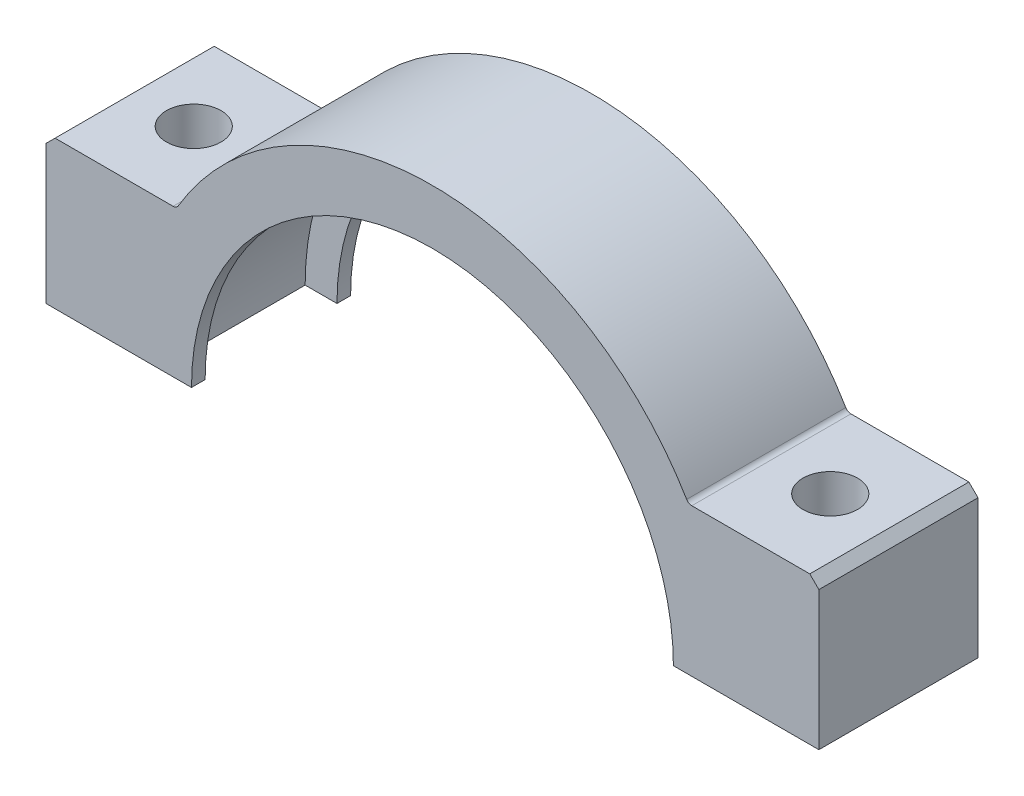
ISO-10303-21;
HEADER;
FILE_DESCRIPTION(('STEP AP214'),'2;1');
FILE_NAME('part.step','',(''),(''),'','','');
FILE_SCHEMA(('AUTOMOTIVE_DESIGN { 1 0 10303 214 1 1 1 1 }'));
ENDSEC;
DATA;
#1=APPLICATION_CONTEXT('core data for automotive mechanical design processes');
#2=APPLICATION_PROTOCOL_DEFINITION('international standard','automotive_design',2000,#1);
#3=PRODUCT_CONTEXT('',#1,'mechanical');
#4=PRODUCT('Part','Part','',(#3));
#5=PRODUCT_RELATED_PRODUCT_CATEGORY('part','',(#4));
#6=PRODUCT_DEFINITION_FORMATION('','',#4);
#7=PRODUCT_DEFINITION_CONTEXT('part definition',#1,'design');
#8=PRODUCT_DEFINITION('design','',#6,#7);
#9=PRODUCT_DEFINITION_SHAPE('','',#8);
#10=(LENGTH_UNIT() NAMED_UNIT(*) SI_UNIT(.MILLI.,.METRE.));
#11=(NAMED_UNIT(*) PLANE_ANGLE_UNIT() SI_UNIT($,.RADIAN.));
#12=(NAMED_UNIT(*) SI_UNIT($,.STERADIAN.) SOLID_ANGLE_UNIT());
#13=UNCERTAINTY_MEASURE_WITH_UNIT(LENGTH_MEASURE(1.E-05),#10,'distance_accuracy_value','');
#14=(GEOMETRIC_REPRESENTATION_CONTEXT(3) GLOBAL_UNCERTAINTY_ASSIGNED_CONTEXT((#13)) GLOBAL_UNIT_ASSIGNED_CONTEXT((#10,
#11,#12)) REPRESENTATION_CONTEXT('',''));
#15=CARTESIAN_POINT('',(0.,0.,0.));
#16=DIRECTION('',(0.,0.,1.));
#17=DIRECTION('',(1.,0.,0.));
#18=AXIS2_PLACEMENT_3D('',#15,#16,#17);
#19=CARTESIAN_POINT('',(-85.,30.5,14.5));
#20=DIRECTION('',(-0.707106781186547,0.707106781186547,0.));
#21=DIRECTION('',(-0.707106781186548,-0.707106781186548,0.));
#22=AXIS2_PLACEMENT_3D('',#19,#20,#21);
#23=PLANE('',#22);
#24=DIRECTION('',(0.,0.,-1.));
#25=VECTOR('',#24,1.);
#26=CARTESIAN_POINT('',(-83.,32.5,14.5));
#27=LINE('',#26,#25);
#28=CARTESIAN_POINT('',(-83.,32.5,17.5));
#29=VERTEX_POINT('',#28);
#30=CARTESIAN_POINT('',(-83.,32.5,-17.5));
#31=VERTEX_POINT('',#30);
#32=EDGE_CURVE('E234',#29,#31,#27,.T.);
#33=ORIENTED_EDGE('',*,*,#32,.T.);
#34=DIRECTION('',(0.707106781186547,0.707106781186547,0.));
#35=VECTOR('',#34,1.);
#36=CARTESIAN_POINT('',(-85.,30.5,-17.5));
#37=LINE('',#36,#35);
#38=CARTESIAN_POINT('',(-85.,30.5,-17.5));
#39=VERTEX_POINT('',#38);
#40=EDGE_CURVE('E324',#39,#31,#37,.T.);
#41=ORIENTED_EDGE('',*,*,#40,.F.);
#42=DIRECTION('',(0.,0.,-1.));
#43=VECTOR('',#42,1.);
#44=CARTESIAN_POINT('',(-85.,30.5,14.5));
#45=LINE('',#44,#43);
#46=CARTESIAN_POINT('',(-85.,30.5,17.5));
#47=VERTEX_POINT('',#46);
#48=EDGE_CURVE('E11',#47,#39,#45,.T.);
#49=ORIENTED_EDGE('',*,*,#48,.F.);
#50=DIRECTION('',(-0.707106781186547,-0.707106781186547,0.));
#51=VECTOR('',#50,1.);
#52=CARTESIAN_POINT('',(-85.,30.5,17.5));
#53=LINE('',#52,#51);
#54=EDGE_CURVE('E188',#29,#47,#53,.T.);
#55=ORIENTED_EDGE('',*,*,#54,.F.);
#56=EDGE_LOOP('',(#33,#41,#49,#55));
#57=FACE_BOUND('',#56,.T.);
#58=ADVANCED_FACE('F32',(#57),#23,.T.);
#59=CARTESIAN_POINT('',(-85.,0.,14.5));
#60=DIRECTION('',(-1.,0.,0.));
#61=DIRECTION('',(0.,0.,1.));
#62=AXIS2_PLACEMENT_3D('',#59,#60,#61);
#63=PLANE('',#62);
#64=ORIENTED_EDGE('',*,*,#48,.T.);
#65=DIRECTION('',(0.,1.,0.));
#66=VECTOR('',#65,1.);
#67=CARTESIAN_POINT('',(-85.,0.,-17.5));
#68=LINE('',#67,#66);
#69=CARTESIAN_POINT('',(-85.,0.,-17.5));
#70=VERTEX_POINT('',#69);
#71=EDGE_CURVE('E338',#70,#39,#68,.T.);
#72=ORIENTED_EDGE('',*,*,#71,.F.);
#73=DIRECTION('',(0.,0.,-1.));
#74=VECTOR('',#73,1.);
#75=CARTESIAN_POINT('',(-85.,0.,14.5));
#76=LINE('',#75,#74);
#77=CARTESIAN_POINT('',(-85.,0.,17.5));
#78=VERTEX_POINT('',#77);
#79=EDGE_CURVE('E42',#78,#70,#76,.T.);
#80=ORIENTED_EDGE('',*,*,#79,.F.);
#81=DIRECTION('',(0.,-1.,0.));
#82=VECTOR('',#81,1.);
#83=CARTESIAN_POINT('',(-85.,0.,17.5));
#84=LINE('',#83,#82);
#85=EDGE_CURVE('E186',#47,#78,#84,.T.);
#86=ORIENTED_EDGE('',*,*,#85,.F.);
#87=EDGE_LOOP('',(#64,#72,#80,#86));
#88=FACE_BOUND('',#87,.T.);
#89=ADVANCED_FACE('F314',(#88),#63,.T.);
#90=CARTESIAN_POINT('',(-60.,0.,14.5));
#91=DIRECTION('',(0.,-1.,0.));
#92=DIRECTION('',(1.,0.,0.));
#93=AXIS2_PLACEMENT_3D('',#90,#91,#92);
#94=PLANE('',#93);
#95=CARTESIAN_POINT('',(-70.,0.,0.));
#96=DIRECTION('',(0.,-1.,0.));
#97=DIRECTION('',(0.,0.,-1.));
#98=AXIS2_PLACEMENT_3D('',#95,#96,#97);
#99=CIRCLE('',#98,5.99999999999999);
#100=CARTESIAN_POINT('',(-70.,0.,-5.99999999999999));
#101=VERTEX_POINT('',#100);
#102=EDGE_CURVE('E276',#101,#101,#99,.T.);
#103=ORIENTED_EDGE('',*,*,#102,.F.);
#104=EDGE_LOOP('',(#103));
#105=FACE_BOUND('',#104,.T.);
#106=ORIENTED_EDGE('',*,*,#79,.T.);
#107=DIRECTION('',(-1.,0.,0.));
#108=VECTOR('',#107,1.);
#109=CARTESIAN_POINT('',(-53.,0.,-17.5));
#110=LINE('',#109,#108);
#111=CARTESIAN_POINT('',(-53.,0.,-17.5));
#112=VERTEX_POINT('',#111);
#113=EDGE_CURVE('E360',#112,#70,#110,.T.);
#114=ORIENTED_EDGE('',*,*,#113,.F.);
#115=DIRECTION('',(0.,0.,1.));
#116=VECTOR('',#115,1.);
#117=CARTESIAN_POINT('',(-53.,0.,-17.5));
#118=LINE('',#117,#116);
#119=CARTESIAN_POINT('',(-53.,0.,-14.5));
#120=VERTEX_POINT('',#119);
#121=EDGE_CURVE('E268',#112,#120,#118,.T.);
#122=ORIENTED_EDGE('',*,*,#121,.T.);
#123=DIRECTION('',(-1.,0.,0.));
#124=VECTOR('',#123,1.);
#125=CARTESIAN_POINT('',(-53.,0.,-14.5));
#126=LINE('',#125,#124);
#127=CARTESIAN_POINT('',(-60.,0.,-14.5));
#128=VERTEX_POINT('',#127);
#129=EDGE_CURVE('E172',#120,#128,#126,.T.);
#130=ORIENTED_EDGE('',*,*,#129,.T.);
#131=DIRECTION('',(0.,0.,-1.));
#132=VECTOR('',#131,1.);
#133=CARTESIAN_POINT('',(-60.,0.,14.5));
#134=LINE('',#133,#132);
#135=CARTESIAN_POINT('',(-60.,0.,14.5));
#136=VERTEX_POINT('',#135);
#137=EDGE_CURVE('E241',#136,#128,#134,.T.);
#138=ORIENTED_EDGE('',*,*,#137,.F.);
#139=DIRECTION('',(1.,0.,0.));
#140=VECTOR('',#139,1.);
#141=CARTESIAN_POINT('',(-53.,0.,14.5));
#142=LINE('',#141,#140);
#143=CARTESIAN_POINT('',(-53.,0.,14.5));
#144=VERTEX_POINT('',#143);
#145=EDGE_CURVE('E49',#136,#144,#142,.T.);
#146=ORIENTED_EDGE('',*,*,#145,.T.);
#147=DIRECTION('',(0.,0.,-1.));
#148=VECTOR('',#147,1.);
#149=CARTESIAN_POINT('',(-53.,0.,17.5));
#150=LINE('',#149,#148);
#151=CARTESIAN_POINT('',(-53.,0.,17.5));
#152=VERTEX_POINT('',#151);
#153=EDGE_CURVE('E169',#152,#144,#150,.T.);
#154=ORIENTED_EDGE('',*,*,#153,.F.);
#155=DIRECTION('',(1.,0.,0.));
#156=VECTOR('',#155,1.);
#157=CARTESIAN_POINT('',(-53.,0.,17.5));
#158=LINE('',#157,#156);
#159=EDGE_CURVE('E161',#78,#152,#158,.T.);
#160=ORIENTED_EDGE('',*,*,#159,.F.);
#161=EDGE_LOOP('',(#106,#114,#122,#130,#138,#146,#154,#160));
#162=FACE_BOUND('',#161,.T.);
#163=ADVANCED_FACE('F266',(#105,#162),#94,.T.);
#164=CARTESIAN_POINT('',(0.,0.,14.5));
#165=DIRECTION('',(0.,0.,-1.));
#166=DIRECTION('',(-1.,0.,0.));
#167=AXIS2_PLACEMENT_3D('',#164,#165,#166);
#168=CYLINDRICAL_SURFACE('',#167,60.);
#169=CARTESIAN_POINT('',(0.,0.,-14.5));
#170=DIRECTION('',(0.,0.,1.));
#171=DIRECTION('',(1.,0.,0.));
#172=AXIS2_PLACEMENT_3D('',#169,#170,#171);
#173=CIRCLE('',#172,60.);
#174=CARTESIAN_POINT('',(60.,0.,-14.5));
#175=VERTEX_POINT('',#174);
#176=EDGE_CURVE('E236',#175,#128,#173,.T.);
#177=ORIENTED_EDGE('',*,*,#176,.F.);
#178=DIRECTION('',(0.,0.,-1.));
#179=VECTOR('',#178,1.);
#180=CARTESIAN_POINT('',(60.,0.,14.5));
#181=LINE('',#180,#179);
#182=CARTESIAN_POINT('',(60.,0.,14.5));
#183=VERTEX_POINT('',#182);
#184=EDGE_CURVE('E247',#183,#175,#181,.T.);
#185=ORIENTED_EDGE('',*,*,#184,.F.);
#186=CARTESIAN_POINT('',(0.,0.,14.5));
#187=DIRECTION('',(0.,0.,1.));
#188=DIRECTION('',(1.,0.,0.));
#189=AXIS2_PLACEMENT_3D('',#186,#187,#188);
#190=CIRCLE('',#189,60.);
#191=EDGE_CURVE('E35',#183,#136,#190,.T.);
#192=ORIENTED_EDGE('',*,*,#191,.T.);
#193=ORIENTED_EDGE('',*,*,#137,.T.);
#194=EDGE_LOOP('',(#177,#185,#192,#193));
#195=FACE_BOUND('',#194,.T.);
#196=ADVANCED_FACE('F257',(#195),#168,.F.);
#197=CARTESIAN_POINT('',(60.,0.,14.5));
#198=DIRECTION('',(0.,1.,0.));
#199=DIRECTION('',(0.,0.,1.));
#200=AXIS2_PLACEMENT_3D('',#197,#198,#199);
#201=PLANE('',#200);
#202=CARTESIAN_POINT('',(70.,0.,0.));
#203=DIRECTION('',(0.,-1.,0.));
#204=DIRECTION('',(0.,0.,-1.));
#205=AXIS2_PLACEMENT_3D('',#202,#203,#204);
#206=CIRCLE('',#205,5.99999999999999);
#207=CARTESIAN_POINT('',(70.,0.,-5.99999999999999));
#208=VERTEX_POINT('',#207);
#209=EDGE_CURVE('E290',#208,#208,#206,.T.);
#210=ORIENTED_EDGE('',*,*,#209,.F.);
#211=EDGE_LOOP('',(#210));
#212=FACE_BOUND('',#211,.T.);
#213=ORIENTED_EDGE('',*,*,#184,.T.);
#214=DIRECTION('',(-1.,0.,0.));
#215=VECTOR('',#214,1.);
#216=CARTESIAN_POINT('',(53.,0.,-14.5));
#217=LINE('',#216,#215);
#218=CARTESIAN_POINT('',(53.,0.,-14.5));
#219=VERTEX_POINT('',#218);
#220=EDGE_CURVE('E265',#175,#219,#217,.T.);
#221=ORIENTED_EDGE('',*,*,#220,.T.);
#222=DIRECTION('',(0.,0.,1.));
#223=VECTOR('',#222,1.);
#224=CARTESIAN_POINT('',(53.,0.,-17.5));
#225=LINE('',#224,#223);
#226=CARTESIAN_POINT('',(53.,0.,-17.5));
#227=VERTEX_POINT('',#226);
#228=EDGE_CURVE('E282',#227,#219,#225,.T.);
#229=ORIENTED_EDGE('',*,*,#228,.F.);
#230=DIRECTION('',(-1.,0.,0.));
#231=VECTOR('',#230,1.);
#232=CARTESIAN_POINT('',(53.,0.,-17.5));
#233=LINE('',#232,#231);
#234=CARTESIAN_POINT('',(85.,0.,-17.5));
#235=VERTEX_POINT('',#234);
#236=EDGE_CURVE('E284',#235,#227,#233,.T.);
#237=ORIENTED_EDGE('',*,*,#236,.F.);
#238=DIRECTION('',(0.,0.,-1.));
#239=VECTOR('',#238,1.);
#240=CARTESIAN_POINT('',(85.,0.,14.5));
#241=LINE('',#240,#239);
#242=CARTESIAN_POINT('',(85.,0.,17.5));
#243=VERTEX_POINT('',#242);
#244=EDGE_CURVE('E150',#243,#235,#241,.T.);
#245=ORIENTED_EDGE('',*,*,#244,.F.);
#246=DIRECTION('',(1.,0.,0.));
#247=VECTOR('',#246,1.);
#248=CARTESIAN_POINT('',(53.,0.,17.5));
#249=LINE('',#248,#247);
#250=CARTESIAN_POINT('',(53.,0.,17.5));
#251=VERTEX_POINT('',#250);
#252=EDGE_CURVE('E142',#251,#243,#249,.T.);
#253=ORIENTED_EDGE('',*,*,#252,.F.);
#254=DIRECTION('',(0.,0.,-1.));
#255=VECTOR('',#254,1.);
#256=CARTESIAN_POINT('',(53.,0.,17.5));
#257=LINE('',#256,#255);
#258=CARTESIAN_POINT('',(53.,0.,14.5));
#259=VERTEX_POINT('',#258);
#260=EDGE_CURVE('E147',#251,#259,#257,.T.);
#261=ORIENTED_EDGE('',*,*,#260,.T.);
#262=DIRECTION('',(1.,0.,0.));
#263=VECTOR('',#262,1.);
#264=CARTESIAN_POINT('',(53.,0.,14.5));
#265=LINE('',#264,#263);
#266=EDGE_CURVE('E178',#259,#183,#265,.T.);
#267=ORIENTED_EDGE('',*,*,#266,.T.);
#268=EDGE_LOOP('',(#213,#221,#229,#237,#245,#253,#261,#267));
#269=FACE_BOUND('',#268,.T.);
#270=ADVANCED_FACE('F144',(#212,#269),#201,.F.);
#271=CARTESIAN_POINT('',(85.,30.5,14.5));
#272=DIRECTION('',(1.,0.,0.));
#273=DIRECTION('',(0.,0.,-1.));
#274=AXIS2_PLACEMENT_3D('',#271,#272,#273);
#275=PLANE('',#274);
#276=ORIENTED_EDGE('',*,*,#244,.T.);
#277=DIRECTION('',(0.,-1.,0.));
#278=VECTOR('',#277,1.);
#279=CARTESIAN_POINT('',(85.,0.,-17.5));
#280=LINE('',#279,#278);
#281=CARTESIAN_POINT('',(85.,30.5,-17.5));
#282=VERTEX_POINT('',#281);
#283=EDGE_CURVE('E355',#282,#235,#280,.T.);
#284=ORIENTED_EDGE('',*,*,#283,.F.);
#285=DIRECTION('',(0.,0.,-1.));
#286=VECTOR('',#285,1.);
#287=CARTESIAN_POINT('',(85.,30.5,14.5));
#288=LINE('',#287,#286);
#289=CARTESIAN_POINT('',(85.,30.5,17.5));
#290=VERTEX_POINT('',#289);
#291=EDGE_CURVE('E215',#290,#282,#288,.T.);
#292=ORIENTED_EDGE('',*,*,#291,.F.);
#293=DIRECTION('',(0.,1.,0.));
#294=VECTOR('',#293,1.);
#295=CARTESIAN_POINT('',(85.,0.,17.5));
#296=LINE('',#295,#294);
#297=EDGE_CURVE('E154',#243,#290,#296,.T.);
#298=ORIENTED_EDGE('',*,*,#297,.F.);
#299=EDGE_LOOP('',(#276,#284,#292,#298));
#300=FACE_BOUND('',#299,.T.);
#301=ADVANCED_FACE('F311',(#300),#275,.T.);
#302=CARTESIAN_POINT('',(83.,32.5,14.5));
#303=DIRECTION('',(0.707106781186547,0.707106781186547,0.));
#304=DIRECTION('',(-0.707106781186548,0.707106781186548,0.));
#305=AXIS2_PLACEMENT_3D('',#302,#303,#304);
#306=PLANE('',#305);
#307=ORIENTED_EDGE('',*,*,#291,.T.);
#308=DIRECTION('',(0.707106781186547,-0.707106781186547,0.));
#309=VECTOR('',#308,1.);
#310=CARTESIAN_POINT('',(85.,30.5,-17.5));
#311=LINE('',#310,#309);
#312=CARTESIAN_POINT('',(83.,32.5,-17.5));
#313=VERTEX_POINT('',#312);
#314=EDGE_CURVE('E218',#313,#282,#311,.T.);
#315=ORIENTED_EDGE('',*,*,#314,.F.);
#316=DIRECTION('',(0.,0.,-1.));
#317=VECTOR('',#316,1.);
#318=CARTESIAN_POINT('',(83.,32.5,14.5));
#319=LINE('',#318,#317);
#320=CARTESIAN_POINT('',(83.,32.5,17.5));
#321=VERTEX_POINT('',#320);
#322=EDGE_CURVE('E217',#321,#313,#319,.T.);
#323=ORIENTED_EDGE('',*,*,#322,.F.);
#324=DIRECTION('',(-0.707106781186547,0.707106781186547,0.));
#325=VECTOR('',#324,1.);
#326=CARTESIAN_POINT('',(85.,30.5,17.5));
#327=LINE('',#326,#325);
#328=EDGE_CURVE('E206',#290,#321,#327,.T.);
#329=ORIENTED_EDGE('',*,*,#328,.F.);
#330=EDGE_LOOP('',(#307,#315,#323,#329));
#331=FACE_BOUND('',#330,.T.);
#332=ADVANCED_FACE('F213',(#331),#306,.T.);
#333=CARTESIAN_POINT('',(57.0463899716578,32.5,14.5));
#334=DIRECTION('',(0.,1.,0.));
#335=DIRECTION('',(0.,0.,1.));
#336=AXIS2_PLACEMENT_3D('',#333,#334,#335);
#337=PLANE('',#336);
#338=CARTESIAN_POINT('',(70.,32.5,0.));
#339=DIRECTION('',(0.,1.,0.));
#340=DIRECTION('',(0.,0.,1.));
#341=AXIS2_PLACEMENT_3D('',#338,#339,#340);
#342=CIRCLE('',#341,5.99999999999999);
#343=CARTESIAN_POINT('',(70.,32.5,5.99999999999999));
#344=VERTEX_POINT('',#343);
#345=EDGE_CURVE('E240',#344,#344,#342,.T.);
#346=ORIENTED_EDGE('',*,*,#345,.F.);
#347=EDGE_LOOP('',(#346));
#348=FACE_BOUND('',#347,.T.);
#349=ORIENTED_EDGE('',*,*,#322,.T.);
#350=DIRECTION('',(1.,0.,0.));
#351=VECTOR('',#350,1.);
#352=CARTESIAN_POINT('',(83.,32.5,-17.5));
#353=LINE('',#352,#351);
#354=CARTESIAN_POINT('',(57.0463899716578,32.5,-17.5));
#355=VERTEX_POINT('',#354);
#356=EDGE_CURVE('E352',#355,#313,#353,.T.);
#357=ORIENTED_EDGE('',*,*,#356,.F.);
#358=DIRECTION('',(0.,0.,-1.));
#359=VECTOR('',#358,1.);
#360=CARTESIAN_POINT('',(57.0463899716578,32.5,14.5));
#361=LINE('',#360,#359);
#362=CARTESIAN_POINT('',(57.0463899716578,32.5,17.5));
#363=VERTEX_POINT('',#362);
#364=EDGE_CURVE('E222',#363,#355,#361,.T.);
#365=ORIENTED_EDGE('',*,*,#364,.F.);
#366=DIRECTION('',(-1.,0.,0.));
#367=VECTOR('',#366,1.);
#368=CARTESIAN_POINT('',(83.,32.5,17.5));
#369=LINE('',#368,#367);
#370=EDGE_CURVE('E203',#321,#363,#369,.T.);
#371=ORIENTED_EDGE('',*,*,#370,.F.);
#372=EDGE_LOOP('',(#349,#357,#365,#371));
#373=FACE_BOUND('',#372,.T.);
#374=ADVANCED_FACE('F300',(#348,#373),#337,.T.);
#375=CARTESIAN_POINT('',(57.0463899716578,33.8160093661301,14.5));
#376=DIRECTION('',(0.,0.,-1.));
#377=DIRECTION('',(-1.,0.,0.));
#378=AXIS2_PLACEMENT_3D('',#375,#376,#377);
#379=CYLINDRICAL_SURFACE('',#378,1.31600936613006);
#380=ORIENTED_EDGE('',*,*,#364,.T.);
#381=CARTESIAN_POINT('',(57.0463899716578,33.8160093661301,-17.5));
#382=DIRECTION('',(0.,0.,1.));
#383=DIRECTION('',(-1.,0.,0.));
#384=AXIS2_PLACEMENT_3D('',#381,#382,#383);
#385=CIRCLE('',#384,1.31600936613008);
#386=CARTESIAN_POINT('',(55.9143317518676,33.1449468960518,-17.5));
#387=VERTEX_POINT('',#386);
#388=EDGE_CURVE('E349',#387,#355,#385,.T.);
#389=ORIENTED_EDGE('',*,*,#388,.F.);
#390=DIRECTION('',(0.,0.,-1.));
#391=VECTOR('',#390,1.);
#392=CARTESIAN_POINT('',(55.9143317518676,33.1449468960518,14.5));
#393=LINE('',#392,#391);
#394=CARTESIAN_POINT('',(55.9143317518676,33.1449468960518,17.5));
#395=VERTEX_POINT('',#394);
#396=EDGE_CURVE('E225',#395,#387,#393,.T.);
#397=ORIENTED_EDGE('',*,*,#396,.F.);
#398=CARTESIAN_POINT('',(57.0463899716578,33.81600936613,17.5));
#399=DIRECTION('',(0.,0.,-1.));
#400=DIRECTION('',(-1.,0.,0.));
#401=AXIS2_PLACEMENT_3D('',#398,#399,#400);
#402=CIRCLE('',#401,1.31600936613003);
#403=EDGE_CURVE('E200',#363,#395,#402,.T.);
#404=ORIENTED_EDGE('',*,*,#403,.F.);
#405=EDGE_LOOP('',(#380,#389,#397,#404));
#406=FACE_BOUND('',#405,.T.);
#407=ADVANCED_FACE('F302',(#406),#379,.F.);
#408=CARTESIAN_POINT('',(0.,0.,14.5));
#409=DIRECTION('',(0.,0.,-1.));
#410=DIRECTION('',(-1.,0.,0.));
#411=AXIS2_PLACEMENT_3D('',#408,#409,#410);
#412=CYLINDRICAL_SURFACE('',#411,65.);
#413=ORIENTED_EDGE('',*,*,#396,.T.);
#414=CARTESIAN_POINT('',(0.,0.,-17.5));
#415=DIRECTION('',(0.,0.,-1.));
#416=DIRECTION('',(1.,0.,0.));
#417=AXIS2_PLACEMENT_3D('',#414,#415,#416);
#418=CIRCLE('',#417,65.);
#419=CARTESIAN_POINT('',(-55.9143317518676,33.1449468960518,-17.5));
#420=VERTEX_POINT('',#419);
#421=EDGE_CURVE('E343',#420,#387,#418,.T.);
#422=ORIENTED_EDGE('',*,*,#421,.F.);
#423=DIRECTION('',(0.,0.,-1.));
#424=VECTOR('',#423,1.);
#425=CARTESIAN_POINT('',(-55.9143317518676,33.1449468960518,14.5));
#426=LINE('',#425,#424);
#427=CARTESIAN_POINT('',(-55.9143317518676,33.1449468960518,17.5));
#428=VERTEX_POINT('',#427);
#429=EDGE_CURVE('E230',#428,#420,#426,.T.);
#430=ORIENTED_EDGE('',*,*,#429,.F.);
#431=CARTESIAN_POINT('',(0.,0.,17.5));
#432=DIRECTION('',(0.,0.,1.));
#433=DIRECTION('',(-1.,0.,0.));
#434=AXIS2_PLACEMENT_3D('',#431,#432,#433);
#435=CIRCLE('',#434,65.);
#436=EDGE_CURVE('E197',#395,#428,#435,.T.);
#437=ORIENTED_EDGE('',*,*,#436,.F.);
#438=EDGE_LOOP('',(#413,#422,#430,#437));
#439=FACE_BOUND('',#438,.T.);
#440=ADVANCED_FACE('F308',(#439),#412,.T.);
#441=CARTESIAN_POINT('',(-57.0463899716578,33.8160093661301,14.5));
#442=DIRECTION('',(0.,0.,-1.));
#443=DIRECTION('',(-1.,0.,0.));
#444=AXIS2_PLACEMENT_3D('',#441,#442,#443);
#445=CYLINDRICAL_SURFACE('',#444,1.31600936613006);
#446=ORIENTED_EDGE('',*,*,#429,.T.);
#447=CARTESIAN_POINT('',(-57.0463899716578,33.81600936613,-17.5));
#448=DIRECTION('',(0.,0.,1.));
#449=DIRECTION('',(1.,0.,0.));
#450=AXIS2_PLACEMENT_3D('',#447,#448,#449);
#451=CIRCLE('',#450,1.31600936613004);
#452=CARTESIAN_POINT('',(-57.0463899716578,32.5,-17.5));
#453=VERTEX_POINT('',#452);
#454=EDGE_CURVE('E341',#453,#420,#451,.T.);
#455=ORIENTED_EDGE('',*,*,#454,.F.);
#456=DIRECTION('',(0.,0.,-1.));
#457=VECTOR('',#456,1.);
#458=CARTESIAN_POINT('',(-57.0463899716578,32.5,14.5));
#459=LINE('',#458,#457);
#460=CARTESIAN_POINT('',(-57.0463899716578,32.5,17.5));
#461=VERTEX_POINT('',#460);
#462=EDGE_CURVE('E232',#461,#453,#459,.T.);
#463=ORIENTED_EDGE('',*,*,#462,.F.);
#464=CARTESIAN_POINT('',(-57.0463899716578,33.8160093661301,17.5));
#465=DIRECTION('',(0.,0.,-1.));
#466=DIRECTION('',(1.,0.,0.));
#467=AXIS2_PLACEMENT_3D('',#464,#465,#466);
#468=CIRCLE('',#467,1.31600936613007);
#469=EDGE_CURVE('E194',#428,#461,#468,.T.);
#470=ORIENTED_EDGE('',*,*,#469,.F.);
#471=EDGE_LOOP('',(#446,#455,#463,#470));
#472=FACE_BOUND('',#471,.T.);
#473=ADVANCED_FACE('F366',(#472),#445,.F.);
#474=CARTESIAN_POINT('',(-83.,32.5,14.5));
#475=DIRECTION('',(0.,1.,0.));
#476=DIRECTION('',(0.,0.,1.));
#477=AXIS2_PLACEMENT_3D('',#474,#475,#476);
#478=PLANE('',#477);
#479=CARTESIAN_POINT('',(-70.,32.5,0.));
#480=DIRECTION('',(0.,1.,0.));
#481=DIRECTION('',(0.,0.,1.));
#482=AXIS2_PLACEMENT_3D('',#479,#480,#481);
#483=CIRCLE('',#482,5.99999999999999);
#484=CARTESIAN_POINT('',(-70.,32.5,5.99999999999999));
#485=VERTEX_POINT('',#484);
#486=EDGE_CURVE('E286',#485,#485,#483,.T.);
#487=ORIENTED_EDGE('',*,*,#486,.F.);
#488=EDGE_LOOP('',(#487));
#489=FACE_BOUND('',#488,.T.);
#490=ORIENTED_EDGE('',*,*,#462,.T.);
#491=DIRECTION('',(1.,0.,0.));
#492=VECTOR('',#491,1.);
#493=CARTESIAN_POINT('',(-83.,32.5,-17.5));
#494=LINE('',#493,#492);
#495=EDGE_CURVE('E334',#31,#453,#494,.T.);
#496=ORIENTED_EDGE('',*,*,#495,.F.);
#497=ORIENTED_EDGE('',*,*,#32,.F.);
#498=DIRECTION('',(-1.,0.,0.));
#499=VECTOR('',#498,1.);
#500=CARTESIAN_POINT('',(-83.,32.5,17.5));
#501=LINE('',#500,#499);
#502=EDGE_CURVE('E191',#461,#29,#501,.T.);
#503=ORIENTED_EDGE('',*,*,#502,.F.);
#504=EDGE_LOOP('',(#490,#496,#497,#503));
#505=FACE_BOUND('',#504,.T.);
#506=ADVANCED_FACE('F340',(#489,#505),#478,.T.);
#507=CARTESIAN_POINT('',(70.,0.,0.));
#508=DIRECTION('',(0.,-1.,0.));
#509=DIRECTION('',(0.,0.,-1.));
#510=AXIS2_PLACEMENT_3D('',#507,#508,#509);
#511=CYLINDRICAL_SURFACE('',#510,5.99999999999999);
#512=ORIENTED_EDGE('',*,*,#209,.T.);
#513=EDGE_LOOP('',(#512));
#514=FACE_BOUND('',#513,.T.);
#515=ORIENTED_EDGE('',*,*,#345,.T.);
#516=EDGE_LOOP('',(#515));
#517=FACE_BOUND('',#516,.T.);
#518=ADVANCED_FACE('F298',(#514,#517),#511,.F.);
#519=CARTESIAN_POINT('',(-70.,0.,0.));
#520=DIRECTION('',(0.,-1.,0.));
#521=DIRECTION('',(0.,0.,-1.));
#522=AXIS2_PLACEMENT_3D('',#519,#520,#521);
#523=CYLINDRICAL_SURFACE('',#522,5.99999999999999);
#524=ORIENTED_EDGE('',*,*,#102,.T.);
#525=EDGE_LOOP('',(#524));
#526=FACE_BOUND('',#525,.T.);
#527=ORIENTED_EDGE('',*,*,#486,.T.);
#528=EDGE_LOOP('',(#527));
#529=FACE_BOUND('',#528,.T.);
#530=ADVANCED_FACE('F386',(#526,#529),#523,.F.);
#531=CARTESIAN_POINT('',(0.,0.,-14.5));
#532=DIRECTION('',(0.,0.,-1.));
#533=DIRECTION('',(-1.,0.,0.));
#534=AXIS2_PLACEMENT_3D('',#531,#532,#533);
#535=PLANE('',#534);
#536=ORIENTED_EDGE('',*,*,#220,.F.);
#537=ORIENTED_EDGE('',*,*,#176,.T.);
#538=ORIENTED_EDGE('',*,*,#129,.F.);
#539=CARTESIAN_POINT('',(0.,0.,-14.5));
#540=DIRECTION('',(0.,0.,1.));
#541=DIRECTION('',(-1.,0.,0.));
#542=AXIS2_PLACEMENT_3D('',#539,#540,#541);
#543=CIRCLE('',#542,53.);
#544=EDGE_CURVE('E168',#219,#120,#543,.T.);
#545=ORIENTED_EDGE('',*,*,#544,.F.);
#546=EDGE_LOOP('',(#536,#537,#538,#545));
#547=FACE_BOUND('',#546,.T.);
#548=ADVANCED_FACE('F262',(#547),#535,.F.);
#549=CARTESIAN_POINT('',(0.,0.,-17.5));
#550=DIRECTION('',(0.,0.,1.));
#551=DIRECTION('',(1.,0.,0.));
#552=AXIS2_PLACEMENT_3D('',#549,#550,#551);
#553=CYLINDRICAL_SURFACE('',#552,53.);
#554=ORIENTED_EDGE('',*,*,#544,.T.);
#555=ORIENTED_EDGE('',*,*,#121,.F.);
#556=CARTESIAN_POINT('',(0.,0.,-17.5));
#557=DIRECTION('',(0.,0.,1.));
#558=DIRECTION('',(-1.,0.,0.));
#559=AXIS2_PLACEMENT_3D('',#556,#557,#558);
#560=CIRCLE('',#559,53.);
#561=EDGE_CURVE('E270',#227,#112,#560,.T.);
#562=ORIENTED_EDGE('',*,*,#561,.F.);
#563=ORIENTED_EDGE('',*,*,#228,.T.);
#564=EDGE_LOOP('',(#554,#555,#562,#563));
#565=FACE_BOUND('',#564,.T.);
#566=ADVANCED_FACE('F359',(#565),#553,.F.);
#567=CARTESIAN_POINT('',(0.,0.,-17.5));
#568=DIRECTION('',(0.,0.,-1.));
#569=DIRECTION('',(-1.,0.,0.));
#570=AXIS2_PLACEMENT_3D('',#567,#568,#569);
#571=PLANE('',#570);
#572=ORIENTED_EDGE('',*,*,#561,.T.);
#573=ORIENTED_EDGE('',*,*,#113,.T.);
#574=ORIENTED_EDGE('',*,*,#71,.T.);
#575=ORIENTED_EDGE('',*,*,#40,.T.);
#576=ORIENTED_EDGE('',*,*,#495,.T.);
#577=ORIENTED_EDGE('',*,*,#454,.T.);
#578=ORIENTED_EDGE('',*,*,#421,.T.);
#579=ORIENTED_EDGE('',*,*,#388,.T.);
#580=ORIENTED_EDGE('',*,*,#356,.T.);
#581=ORIENTED_EDGE('',*,*,#314,.T.);
#582=ORIENTED_EDGE('',*,*,#283,.T.);
#583=ORIENTED_EDGE('',*,*,#236,.T.);
#584=EDGE_LOOP('',(#572,#573,#574,#575,#576,#577,#578,#579,#580,#581,#582,#583));
#585=FACE_BOUND('',#584,.T.);
#586=ADVANCED_FACE('F332',(#585),#571,.T.);
#587=CARTESIAN_POINT('',(0.,0.,17.5));
#588=DIRECTION('',(0.,0.,-1.));
#589=DIRECTION('',(-1.,0.,0.));
#590=AXIS2_PLACEMENT_3D('',#587,#588,#589);
#591=CYLINDRICAL_SURFACE('',#590,53.);
#592=CARTESIAN_POINT('',(0.,0.,14.5));
#593=DIRECTION('',(0.,0.,-1.));
#594=DIRECTION('',(1.,0.,0.));
#595=AXIS2_PLACEMENT_3D('',#592,#593,#594);
#596=CIRCLE('',#595,53.);
#597=EDGE_CURVE('E167',#144,#259,#596,.T.);
#598=ORIENTED_EDGE('',*,*,#597,.T.);
#599=ORIENTED_EDGE('',*,*,#260,.F.);
#600=CARTESIAN_POINT('',(0.,0.,17.5));
#601=DIRECTION('',(0.,0.,-1.));
#602=DIRECTION('',(1.,0.,0.));
#603=AXIS2_PLACEMENT_3D('',#600,#601,#602);
#604=CIRCLE('',#603,53.);
#605=EDGE_CURVE('E155',#152,#251,#604,.T.);
#606=ORIENTED_EDGE('',*,*,#605,.F.);
#607=ORIENTED_EDGE('',*,*,#153,.T.);
#608=EDGE_LOOP('',(#598,#599,#606,#607));
#609=FACE_BOUND('',#608,.T.);
#610=ADVANCED_FACE('F166',(#609),#591,.F.);
#611=CARTESIAN_POINT('',(0.,0.,17.5));
#612=DIRECTION('',(0.,0.,1.));
#613=DIRECTION('',(1.,0.,0.));
#614=AXIS2_PLACEMENT_3D('',#611,#612,#613);
#615=PLANE('',#614);
#616=ORIENTED_EDGE('',*,*,#605,.T.);
#617=ORIENTED_EDGE('',*,*,#252,.T.);
#618=ORIENTED_EDGE('',*,*,#297,.T.);
#619=ORIENTED_EDGE('',*,*,#328,.T.);
#620=ORIENTED_EDGE('',*,*,#370,.T.);
#621=ORIENTED_EDGE('',*,*,#403,.T.);
#622=ORIENTED_EDGE('',*,*,#436,.T.);
#623=ORIENTED_EDGE('',*,*,#469,.T.);
#624=ORIENTED_EDGE('',*,*,#502,.T.);
#625=ORIENTED_EDGE('',*,*,#54,.T.);
#626=ORIENTED_EDGE('',*,*,#85,.T.);
#627=ORIENTED_EDGE('',*,*,#159,.T.);
#628=EDGE_LOOP('',(#616,#617,#618,#619,#620,#621,#622,#623,#624,#625,#626,#627));
#629=FACE_BOUND('',#628,.T.);
#630=ADVANCED_FACE('F158',(#629),#615,.T.);
#631=CARTESIAN_POINT('',(0.,0.,14.5));
#632=DIRECTION('',(0.,0.,1.));
#633=DIRECTION('',(1.,0.,0.));
#634=AXIS2_PLACEMENT_3D('',#631,#632,#633);
#635=PLANE('',#634);
#636=ORIENTED_EDGE('',*,*,#191,.F.);
#637=ORIENTED_EDGE('',*,*,#266,.F.);
#638=ORIENTED_EDGE('',*,*,#597,.F.);
#639=ORIENTED_EDGE('',*,*,#145,.F.);
#640=EDGE_LOOP('',(#636,#637,#638,#639));
#641=FACE_BOUND('',#640,.T.);
#642=ADVANCED_FACE('F398',(#641),#635,.F.);
#643=CLOSED_SHELL('',(#58,#89,#163,#196,#270,#301,#332,#374,#407,#440,#473,#506,#518,#530,#548,
#566,#586,#610,#630,#642));
#644=MANIFOLD_SOLID_BREP('B2',#643);
#645=ADVANCED_BREP_SHAPE_REPRESENTATION('',(#18,#644),#14);
#646=SHAPE_DEFINITION_REPRESENTATION(#9,#645);
ENDSEC;
END-ISO-10303-21;
